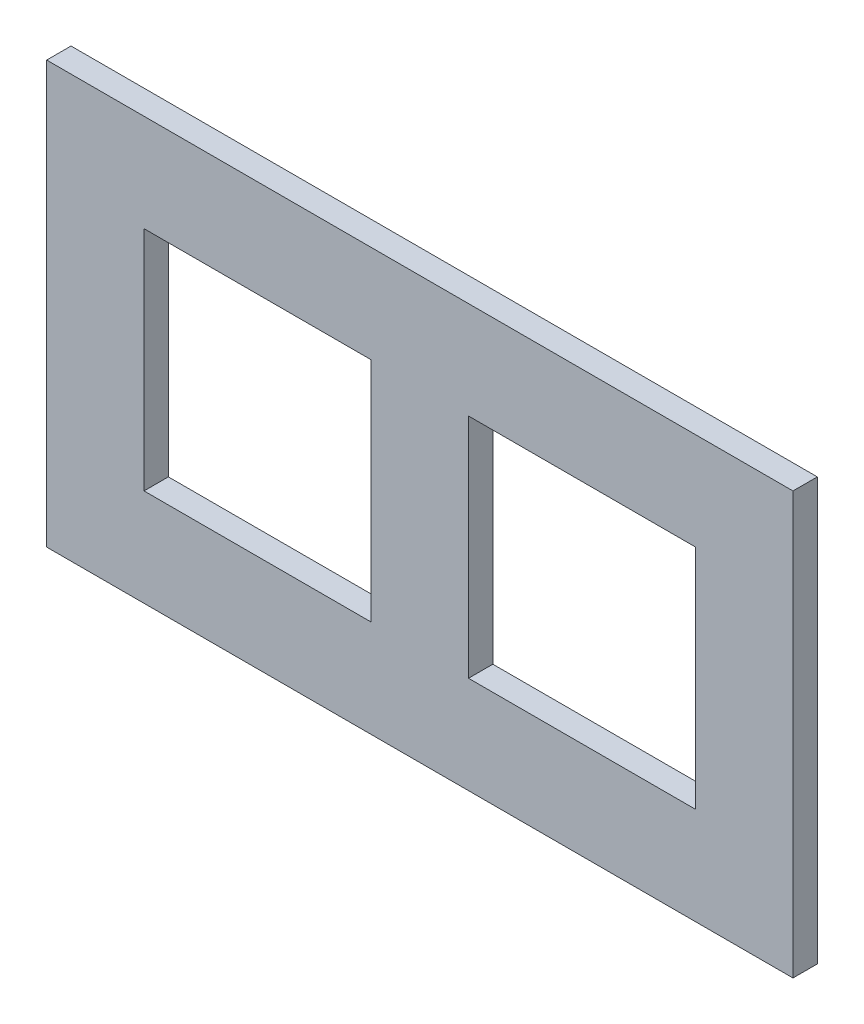
ISO-10303-21;
HEADER;
FILE_DESCRIPTION(('STEP AP214'),'2;1');
FILE_NAME('part.step','',(''),(''),'','','');
FILE_SCHEMA(('AUTOMOTIVE_DESIGN { 1 0 10303 214 1 1 1 1 }'));
ENDSEC;
DATA;
#1=APPLICATION_CONTEXT('core data for automotive mechanical design processes');
#2=APPLICATION_PROTOCOL_DEFINITION('international standard','automotive_design',2000,#1);
#3=PRODUCT_CONTEXT('',#1,'mechanical');
#4=PRODUCT('Part','Part','',(#3));
#5=PRODUCT_RELATED_PRODUCT_CATEGORY('part','',(#4));
#6=PRODUCT_DEFINITION_FORMATION('','',#4);
#7=PRODUCT_DEFINITION_CONTEXT('part definition',#1,'design');
#8=PRODUCT_DEFINITION('design','',#6,#7);
#9=PRODUCT_DEFINITION_SHAPE('','',#8);
#10=(LENGTH_UNIT() NAMED_UNIT(*) SI_UNIT(.MILLI.,.METRE.));
#11=(NAMED_UNIT(*) PLANE_ANGLE_UNIT() SI_UNIT($,.RADIAN.));
#12=(NAMED_UNIT(*) SI_UNIT($,.STERADIAN.) SOLID_ANGLE_UNIT());
#13=UNCERTAINTY_MEASURE_WITH_UNIT(LENGTH_MEASURE(1.E-05),#10,'distance_accuracy_value','');
#14=(GEOMETRIC_REPRESENTATION_CONTEXT(3) GLOBAL_UNCERTAINTY_ASSIGNED_CONTEXT((#13)) GLOBAL_UNIT_ASSIGNED_CONTEXT((#10,
#11,#12)) REPRESENTATION_CONTEXT('',''));
#15=CARTESIAN_POINT('',(0.,0.,0.));
#16=DIRECTION('',(0.,0.,1.));
#17=DIRECTION('',(1.,0.,0.));
#18=AXIS2_PLACEMENT_3D('',#15,#16,#17);
#19=CARTESIAN_POINT('',(0.,0.,1.5));
#20=DIRECTION('',(0.,0.,1.));
#21=DIRECTION('',(1.,0.,0.));
#22=AXIS2_PLACEMENT_3D('',#19,#20,#21);
#23=PLANE('',#22);
#24=DIRECTION('',(0.,1.,0.));
#25=VECTOR('',#24,1.);
#26=CARTESIAN_POINT('',(0.,0.,1.5));
#27=LINE('',#26,#25);
#28=CARTESIAN_POINT('',(0.,0.,1.5));
#29=VERTEX_POINT('',#28);
#30=CARTESIAN_POINT('',(0.,26.,1.5));
#31=VERTEX_POINT('',#30);
#32=EDGE_CURVE('E189',#29,#31,#27,.T.);
#33=ORIENTED_EDGE('',*,*,#32,.T.);
#34=DIRECTION('',(-1.,0.,0.));
#35=VECTOR('',#34,1.);
#36=CARTESIAN_POINT('',(0.,26.,1.5));
#37=LINE('',#36,#35);
#38=CARTESIAN_POINT('',(-46.,26.,1.5));
#39=VERTEX_POINT('',#38);
#40=EDGE_CURVE('E192',#31,#39,#37,.T.);
#41=ORIENTED_EDGE('',*,*,#40,.T.);
#42=DIRECTION('',(0.,-1.,0.));
#43=VECTOR('',#42,1.);
#44=CARTESIAN_POINT('',(-46.,0.,1.5));
#45=LINE('',#44,#43);
#46=CARTESIAN_POINT('',(-46.,0.,1.5));
#47=VERTEX_POINT('',#46);
#48=EDGE_CURVE('E195',#39,#47,#45,.T.);
#49=ORIENTED_EDGE('',*,*,#48,.T.);
#50=DIRECTION('',(1.,0.,0.));
#51=VECTOR('',#50,1.);
#52=CARTESIAN_POINT('',(0.,0.,1.5));
#53=LINE('',#52,#51);
#54=EDGE_CURVE('E197',#47,#29,#53,.T.);
#55=ORIENTED_EDGE('',*,*,#54,.T.);
#56=EDGE_LOOP('',(#33,#41,#49,#55));
#57=FACE_BOUND('',#56,.T.);
#58=DIRECTION('',(1.,0.,0.));
#59=VECTOR('',#58,1.);
#60=CARTESIAN_POINT('',(-40.,6.,1.5));
#61=LINE('',#60,#59);
#62=CARTESIAN_POINT('',(-40.,6.,1.5));
#63=VERTEX_POINT('',#62);
#64=CARTESIAN_POINT('',(-26.,6.,1.5));
#65=VERTEX_POINT('',#64);
#66=EDGE_CURVE('E160',#63,#65,#61,.T.);
#67=ORIENTED_EDGE('',*,*,#66,.F.);
#68=DIRECTION('',(0.,-1.,0.));
#69=VECTOR('',#68,1.);
#70=CARTESIAN_POINT('',(-40.,20.,1.5));
#71=LINE('',#70,#69);
#72=CARTESIAN_POINT('',(-40.,20.,1.5));
#73=VERTEX_POINT('',#72);
#74=EDGE_CURVE('E158',#73,#63,#71,.T.);
#75=ORIENTED_EDGE('',*,*,#74,.F.);
#76=DIRECTION('',(-1.,0.,0.));
#77=VECTOR('',#76,1.);
#78=CARTESIAN_POINT('',(-40.,20.,1.5));
#79=LINE('',#78,#77);
#80=CARTESIAN_POINT('',(-26.,20.,1.5));
#81=VERTEX_POINT('',#80);
#82=EDGE_CURVE('E166',#81,#73,#79,.T.);
#83=ORIENTED_EDGE('',*,*,#82,.F.);
#84=DIRECTION('',(0.,1.,0.));
#85=VECTOR('',#84,1.);
#86=CARTESIAN_POINT('',(-26.,20.,1.5));
#87=LINE('',#86,#85);
#88=EDGE_CURVE('E163',#65,#81,#87,.T.);
#89=ORIENTED_EDGE('',*,*,#88,.F.);
#90=EDGE_LOOP('',(#67,#75,#83,#89));
#91=FACE_BOUND('',#90,.T.);
#92=DIRECTION('',(1.,0.,0.));
#93=VECTOR('',#92,1.);
#94=CARTESIAN_POINT('',(-20.,6.,1.5));
#95=LINE('',#94,#93);
#96=CARTESIAN_POINT('',(-20.,6.,1.5));
#97=VERTEX_POINT('',#96);
#98=CARTESIAN_POINT('',(-6.00000000000001,6.,1.5));
#99=VERTEX_POINT('',#98);
#100=EDGE_CURVE('E130',#97,#99,#95,.T.);
#101=ORIENTED_EDGE('',*,*,#100,.F.);
#102=DIRECTION('',(0.,-1.,0.));
#103=VECTOR('',#102,1.);
#104=CARTESIAN_POINT('',(-20.,20.,1.5));
#105=LINE('',#104,#103);
#106=CARTESIAN_POINT('',(-20.,20.,1.5));
#107=VERTEX_POINT('',#106);
#108=EDGE_CURVE('E122',#107,#97,#105,.T.);
#109=ORIENTED_EDGE('',*,*,#108,.F.);
#110=DIRECTION('',(-1.,0.,0.));
#111=VECTOR('',#110,1.);
#112=CARTESIAN_POINT('',(-20.,20.,1.5));
#113=LINE('',#112,#111);
#114=CARTESIAN_POINT('',(-6.00000000000001,20.,1.5));
#115=VERTEX_POINT('',#114);
#116=EDGE_CURVE('E144',#115,#107,#113,.T.);
#117=ORIENTED_EDGE('',*,*,#116,.F.);
#118=DIRECTION('',(0.,1.,0.));
#119=VECTOR('',#118,1.);
#120=CARTESIAN_POINT('',(-6.00000000000001,20.,1.5));
#121=LINE('',#120,#119);
#122=EDGE_CURVE('E142',#99,#115,#121,.T.);
#123=ORIENTED_EDGE('',*,*,#122,.F.);
#124=EDGE_LOOP('',(#101,#109,#117,#123));
#125=FACE_BOUND('',#124,.T.);
#126=ADVANCED_FACE('F33',(#57,#91,#125),#23,.T.);
#127=CARTESIAN_POINT('',(0.,0.,0.));
#128=DIRECTION('',(0.,0.,1.));
#129=DIRECTION('',(1.,0.,0.));
#130=AXIS2_PLACEMENT_3D('',#127,#128,#129);
#131=PLANE('',#130);
#132=DIRECTION('',(0.,-1.,0.));
#133=VECTOR('',#132,1.);
#134=CARTESIAN_POINT('',(-40.,20.,0.));
#135=LINE('',#134,#133);
#136=CARTESIAN_POINT('',(-40.,20.,0.));
#137=VERTEX_POINT('',#136);
#138=CARTESIAN_POINT('',(-40.,6.,0.));
#139=VERTEX_POINT('',#138);
#140=EDGE_CURVE('E138',#137,#139,#135,.T.);
#141=ORIENTED_EDGE('',*,*,#140,.T.);
#142=DIRECTION('',(1.,0.,0.));
#143=VECTOR('',#142,1.);
#144=CARTESIAN_POINT('',(-40.,6.,0.));
#145=LINE('',#144,#143);
#146=CARTESIAN_POINT('',(-26.,6.,0.));
#147=VERTEX_POINT('',#146);
#148=EDGE_CURVE('E171',#139,#147,#145,.T.);
#149=ORIENTED_EDGE('',*,*,#148,.T.);
#150=DIRECTION('',(0.,1.,0.));
#151=VECTOR('',#150,1.);
#152=CARTESIAN_POINT('',(-26.,20.,0.));
#153=LINE('',#152,#151);
#154=CARTESIAN_POINT('',(-26.,20.,0.));
#155=VERTEX_POINT('',#154);
#156=EDGE_CURVE('E174',#147,#155,#153,.T.);
#157=ORIENTED_EDGE('',*,*,#156,.T.);
#158=DIRECTION('',(-1.,0.,0.));
#159=VECTOR('',#158,1.);
#160=CARTESIAN_POINT('',(-40.,20.,0.));
#161=LINE('',#160,#159);
#162=EDGE_CURVE('E161',#155,#137,#161,.T.);
#163=ORIENTED_EDGE('',*,*,#162,.T.);
#164=EDGE_LOOP('',(#141,#149,#157,#163));
#165=FACE_BOUND('',#164,.T.);
#166=DIRECTION('',(0.,1.,0.));
#167=VECTOR('',#166,1.);
#168=CARTESIAN_POINT('',(0.,0.,0.));
#169=LINE('',#168,#167);
#170=CARTESIAN_POINT('',(0.,0.,0.));
#171=VERTEX_POINT('',#170);
#172=CARTESIAN_POINT('',(0.,26.,0.));
#173=VERTEX_POINT('',#172);
#174=EDGE_CURVE('E188',#171,#173,#169,.T.);
#175=ORIENTED_EDGE('',*,*,#174,.F.);
#176=DIRECTION('',(1.,0.,0.));
#177=VECTOR('',#176,1.);
#178=CARTESIAN_POINT('',(0.,0.,0.));
#179=LINE('',#178,#177);
#180=CARTESIAN_POINT('',(-46.,0.,0.));
#181=VERTEX_POINT('',#180);
#182=EDGE_CURVE('E193',#181,#171,#179,.T.);
#183=ORIENTED_EDGE('',*,*,#182,.F.);
#184=DIRECTION('',(0.,-1.,0.));
#185=VECTOR('',#184,1.);
#186=CARTESIAN_POINT('',(-46.,0.,0.));
#187=LINE('',#186,#185);
#188=CARTESIAN_POINT('',(-46.,26.,0.));
#189=VERTEX_POINT('',#188);
#190=EDGE_CURVE('E204',#189,#181,#187,.T.);
#191=ORIENTED_EDGE('',*,*,#190,.F.);
#192=DIRECTION('',(-1.,0.,0.));
#193=VECTOR('',#192,1.);
#194=CARTESIAN_POINT('',(0.,26.,0.));
#195=LINE('',#194,#193);
#196=EDGE_CURVE('E202',#173,#189,#195,.T.);
#197=ORIENTED_EDGE('',*,*,#196,.F.);
#198=EDGE_LOOP('',(#175,#183,#191,#197));
#199=FACE_BOUND('',#198,.T.);
#200=DIRECTION('',(0.,-1.,0.));
#201=VECTOR('',#200,1.);
#202=CARTESIAN_POINT('',(-20.,20.,0.));
#203=LINE('',#202,#201);
#204=CARTESIAN_POINT('',(-20.,20.,0.));
#205=VERTEX_POINT('',#204);
#206=CARTESIAN_POINT('',(-20.,6.,0.));
#207=VERTEX_POINT('',#206);
#208=EDGE_CURVE('E56',#205,#207,#203,.T.);
#209=ORIENTED_EDGE('',*,*,#208,.T.);
#210=DIRECTION('',(1.,0.,0.));
#211=VECTOR('',#210,1.);
#212=CARTESIAN_POINT('',(-20.,6.,0.));
#213=LINE('',#212,#211);
#214=CARTESIAN_POINT('',(-6.00000000000001,6.,0.));
#215=VERTEX_POINT('',#214);
#216=EDGE_CURVE('E137',#207,#215,#213,.T.);
#217=ORIENTED_EDGE('',*,*,#216,.T.);
#218=DIRECTION('',(0.,1.,0.));
#219=VECTOR('',#218,1.);
#220=CARTESIAN_POINT('',(-6.00000000000001,20.,0.));
#221=LINE('',#220,#219);
#222=CARTESIAN_POINT('',(-6.00000000000001,20.,0.));
#223=VERTEX_POINT('',#222);
#224=EDGE_CURVE('E150',#215,#223,#221,.T.);
#225=ORIENTED_EDGE('',*,*,#224,.T.);
#226=DIRECTION('',(-1.,0.,0.));
#227=VECTOR('',#226,1.);
#228=CARTESIAN_POINT('',(-20.,20.,0.));
#229=LINE('',#228,#227);
#230=EDGE_CURVE('E131',#223,#205,#229,.T.);
#231=ORIENTED_EDGE('',*,*,#230,.T.);
#232=EDGE_LOOP('',(#209,#217,#225,#231));
#233=FACE_BOUND('',#232,.T.);
#234=ADVANCED_FACE('F222',(#165,#199,#233),#131,.F.);
#235=CARTESIAN_POINT('',(0.,0.,1.5));
#236=DIRECTION('',(-1.,0.,0.));
#237=DIRECTION('',(0.,0.,1.));
#238=AXIS2_PLACEMENT_3D('',#235,#236,#237);
#239=PLANE('',#238);
#240=ORIENTED_EDGE('',*,*,#174,.T.);
#241=DIRECTION('',(0.,0.,-1.));
#242=VECTOR('',#241,1.);
#243=CARTESIAN_POINT('',(0.,26.,1.5));
#244=LINE('',#243,#242);
#245=EDGE_CURVE('E11',#31,#173,#244,.T.);
#246=ORIENTED_EDGE('',*,*,#245,.F.);
#247=ORIENTED_EDGE('',*,*,#32,.F.);
#248=DIRECTION('',(0.,0.,-1.));
#249=VECTOR('',#248,1.);
#250=CARTESIAN_POINT('',(0.,0.,1.5));
#251=LINE('',#250,#249);
#252=EDGE_CURVE('E199',#29,#171,#251,.T.);
#253=ORIENTED_EDGE('',*,*,#252,.T.);
#254=EDGE_LOOP('',(#240,#246,#247,#253));
#255=FACE_BOUND('',#254,.T.);
#256=ADVANCED_FACE('F35',(#255),#239,.F.);
#257=CARTESIAN_POINT('',(0.,26.,1.5));
#258=DIRECTION('',(0.,-1.,0.));
#259=DIRECTION('',(1.,0.,0.));
#260=AXIS2_PLACEMENT_3D('',#257,#258,#259);
#261=PLANE('',#260);
#262=ORIENTED_EDGE('',*,*,#196,.T.);
#263=DIRECTION('',(0.,0.,-1.));
#264=VECTOR('',#263,1.);
#265=CARTESIAN_POINT('',(-46.,26.,1.5));
#266=LINE('',#265,#264);
#267=EDGE_CURVE('E41',#39,#189,#266,.T.);
#268=ORIENTED_EDGE('',*,*,#267,.F.);
#269=ORIENTED_EDGE('',*,*,#40,.F.);
#270=ORIENTED_EDGE('',*,*,#245,.T.);
#271=EDGE_LOOP('',(#262,#268,#269,#270));
#272=FACE_BOUND('',#271,.T.);
#273=ADVANCED_FACE('F233',(#272),#261,.F.);
#274=CARTESIAN_POINT('',(-46.,0.,1.5));
#275=DIRECTION('',(1.,0.,0.));
#276=DIRECTION('',(0.,0.,-1.));
#277=AXIS2_PLACEMENT_3D('',#274,#275,#276);
#278=PLANE('',#277);
#279=ORIENTED_EDGE('',*,*,#190,.T.);
#280=DIRECTION('',(0.,0.,-1.));
#281=VECTOR('',#280,1.);
#282=CARTESIAN_POINT('',(-46.,0.,1.5));
#283=LINE('',#282,#281);
#284=EDGE_CURVE('E209',#47,#181,#283,.T.);
#285=ORIENTED_EDGE('',*,*,#284,.F.);
#286=ORIENTED_EDGE('',*,*,#48,.F.);
#287=ORIENTED_EDGE('',*,*,#267,.T.);
#288=EDGE_LOOP('',(#279,#285,#286,#287));
#289=FACE_BOUND('',#288,.T.);
#290=ADVANCED_FACE('F216',(#289),#278,.F.);
#291=CARTESIAN_POINT('',(0.,0.,1.5));
#292=DIRECTION('',(0.,1.,0.));
#293=DIRECTION('',(-1.,0.,0.));
#294=AXIS2_PLACEMENT_3D('',#291,#292,#293);
#295=PLANE('',#294);
#296=ORIENTED_EDGE('',*,*,#182,.T.);
#297=ORIENTED_EDGE('',*,*,#252,.F.);
#298=ORIENTED_EDGE('',*,*,#54,.F.);
#299=ORIENTED_EDGE('',*,*,#284,.T.);
#300=EDGE_LOOP('',(#296,#297,#298,#299));
#301=FACE_BOUND('',#300,.T.);
#302=ADVANCED_FACE('F226',(#301),#295,.F.);
#303=CARTESIAN_POINT('',(-40.,20.,1.5));
#304=DIRECTION('',(1.,0.,0.));
#305=DIRECTION('',(0.,1.,0.));
#306=AXIS2_PLACEMENT_3D('',#303,#304,#305);
#307=PLANE('',#306);
#308=ORIENTED_EDGE('',*,*,#140,.F.);
#309=DIRECTION('',(0.,0.,-1.));
#310=VECTOR('',#309,1.);
#311=CARTESIAN_POINT('',(-40.,20.,1.5));
#312=LINE('',#311,#310);
#313=EDGE_CURVE('E168',#73,#137,#312,.T.);
#314=ORIENTED_EDGE('',*,*,#313,.F.);
#315=ORIENTED_EDGE('',*,*,#74,.T.);
#316=DIRECTION('',(0.,0.,-1.));
#317=VECTOR('',#316,1.);
#318=CARTESIAN_POINT('',(-40.,6.,1.5));
#319=LINE('',#318,#317);
#320=EDGE_CURVE('E185',#63,#139,#319,.T.);
#321=ORIENTED_EDGE('',*,*,#320,.T.);
#322=EDGE_LOOP('',(#308,#314,#315,#321));
#323=FACE_BOUND('',#322,.T.);
#324=ADVANCED_FACE('F248',(#323),#307,.T.);
#325=CARTESIAN_POINT('',(-40.,6.,1.5));
#326=DIRECTION('',(0.,1.,0.));
#327=DIRECTION('',(0.,0.,1.));
#328=AXIS2_PLACEMENT_3D('',#325,#326,#327);
#329=PLANE('',#328);
#330=ORIENTED_EDGE('',*,*,#148,.F.);
#331=ORIENTED_EDGE('',*,*,#320,.F.);
#332=ORIENTED_EDGE('',*,*,#66,.T.);
#333=DIRECTION('',(0.,0.,-1.));
#334=VECTOR('',#333,1.);
#335=CARTESIAN_POINT('',(-26.,6.,1.5));
#336=LINE('',#335,#334);
#337=EDGE_CURVE('E183',#65,#147,#336,.T.);
#338=ORIENTED_EDGE('',*,*,#337,.T.);
#339=EDGE_LOOP('',(#330,#331,#332,#338));
#340=FACE_BOUND('',#339,.T.);
#341=ADVANCED_FACE('F255',(#340),#329,.T.);
#342=CARTESIAN_POINT('',(-26.,20.,1.5));
#343=DIRECTION('',(-1.,0.,0.));
#344=DIRECTION('',(0.,-1.,0.));
#345=AXIS2_PLACEMENT_3D('',#342,#343,#344);
#346=PLANE('',#345);
#347=ORIENTED_EDGE('',*,*,#156,.F.);
#348=ORIENTED_EDGE('',*,*,#337,.F.);
#349=ORIENTED_EDGE('',*,*,#88,.T.);
#350=DIRECTION('',(0.,0.,-1.));
#351=VECTOR('',#350,1.);
#352=CARTESIAN_POINT('',(-26.,20.,1.5));
#353=LINE('',#352,#351);
#354=EDGE_CURVE('E181',#81,#155,#353,.T.);
#355=ORIENTED_EDGE('',*,*,#354,.T.);
#356=EDGE_LOOP('',(#347,#348,#349,#355));
#357=FACE_BOUND('',#356,.T.);
#358=ADVANCED_FACE('F260',(#357),#346,.T.);
#359=CARTESIAN_POINT('',(-40.,20.,1.5));
#360=DIRECTION('',(0.,-1.,0.));
#361=DIRECTION('',(0.,0.,-1.));
#362=AXIS2_PLACEMENT_3D('',#359,#360,#361);
#363=PLANE('',#362);
#364=ORIENTED_EDGE('',*,*,#162,.F.);
#365=ORIENTED_EDGE('',*,*,#354,.F.);
#366=ORIENTED_EDGE('',*,*,#82,.T.);
#367=ORIENTED_EDGE('',*,*,#313,.T.);
#368=EDGE_LOOP('',(#364,#365,#366,#367));
#369=FACE_BOUND('',#368,.T.);
#370=ADVANCED_FACE('F267',(#369),#363,.T.);
#371=CARTESIAN_POINT('',(-20.,20.,1.5));
#372=DIRECTION('',(1.,0.,0.));
#373=DIRECTION('',(0.,0.,-1.));
#374=AXIS2_PLACEMENT_3D('',#371,#372,#373);
#375=PLANE('',#374);
#376=ORIENTED_EDGE('',*,*,#208,.F.);
#377=DIRECTION('',(0.,0.,-1.));
#378=VECTOR('',#377,1.);
#379=CARTESIAN_POINT('',(-20.,20.,1.5));
#380=LINE('',#379,#378);
#381=EDGE_CURVE('E126',#107,#205,#380,.T.);
#382=ORIENTED_EDGE('',*,*,#381,.F.);
#383=ORIENTED_EDGE('',*,*,#108,.T.);
#384=DIRECTION('',(0.,0.,-1.));
#385=VECTOR('',#384,1.);
#386=CARTESIAN_POINT('',(-20.,6.,1.5));
#387=LINE('',#386,#385);
#388=EDGE_CURVE('E125',#97,#207,#387,.T.);
#389=ORIENTED_EDGE('',*,*,#388,.T.);
#390=EDGE_LOOP('',(#376,#382,#383,#389));
#391=FACE_BOUND('',#390,.T.);
#392=ADVANCED_FACE('F124',(#391),#375,.T.);
#393=CARTESIAN_POINT('',(-20.,6.,1.5));
#394=DIRECTION('',(0.,1.,0.));
#395=DIRECTION('',(-1.,0.,0.));
#396=AXIS2_PLACEMENT_3D('',#393,#394,#395);
#397=PLANE('',#396);
#398=ORIENTED_EDGE('',*,*,#216,.F.);
#399=ORIENTED_EDGE('',*,*,#388,.F.);
#400=ORIENTED_EDGE('',*,*,#100,.T.);
#401=DIRECTION('',(0.,0.,-1.));
#402=VECTOR('',#401,1.);
#403=CARTESIAN_POINT('',(-6.00000000000001,6.,1.5));
#404=LINE('',#403,#402);
#405=EDGE_CURVE('E139',#99,#215,#404,.T.);
#406=ORIENTED_EDGE('',*,*,#405,.T.);
#407=EDGE_LOOP('',(#398,#399,#400,#406));
#408=FACE_BOUND('',#407,.T.);
#409=ADVANCED_FACE('F134',(#408),#397,.T.);
#410=CARTESIAN_POINT('',(-6.00000000000001,20.,1.5));
#411=DIRECTION('',(-1.,0.,0.));
#412=DIRECTION('',(0.,-1.,0.));
#413=AXIS2_PLACEMENT_3D('',#410,#411,#412);
#414=PLANE('',#413);
#415=ORIENTED_EDGE('',*,*,#224,.F.);
#416=ORIENTED_EDGE('',*,*,#405,.F.);
#417=ORIENTED_EDGE('',*,*,#122,.T.);
#418=DIRECTION('',(0.,0.,-1.));
#419=VECTOR('',#418,1.);
#420=CARTESIAN_POINT('',(-6.00000000000001,20.,1.5));
#421=LINE('',#420,#419);
#422=EDGE_CURVE('E48',#115,#223,#421,.T.);
#423=ORIENTED_EDGE('',*,*,#422,.T.);
#424=EDGE_LOOP('',(#415,#416,#417,#423));
#425=FACE_BOUND('',#424,.T.);
#426=ADVANCED_FACE('F285',(#425),#414,.T.);
#427=CARTESIAN_POINT('',(-20.,20.,1.5));
#428=DIRECTION('',(0.,-1.,0.));
#429=DIRECTION('',(1.,0.,0.));
#430=AXIS2_PLACEMENT_3D('',#427,#428,#429);
#431=PLANE('',#430);
#432=ORIENTED_EDGE('',*,*,#230,.F.);
#433=ORIENTED_EDGE('',*,*,#422,.F.);
#434=ORIENTED_EDGE('',*,*,#116,.T.);
#435=ORIENTED_EDGE('',*,*,#381,.T.);
#436=EDGE_LOOP('',(#432,#433,#434,#435));
#437=FACE_BOUND('',#436,.T.);
#438=ADVANCED_FACE('F288',(#437),#431,.T.);
#439=CLOSED_SHELL('',(#126,#234,#256,#273,#290,#302,#324,#341,#358,#370,#392,#409,#426,#438));
#440=MANIFOLD_SOLID_BREP('B2',#439);
#441=ADVANCED_BREP_SHAPE_REPRESENTATION('',(#18,#440),#14);
#442=SHAPE_DEFINITION_REPRESENTATION(#9,#441);
ENDSEC;
END-ISO-10303-21;
